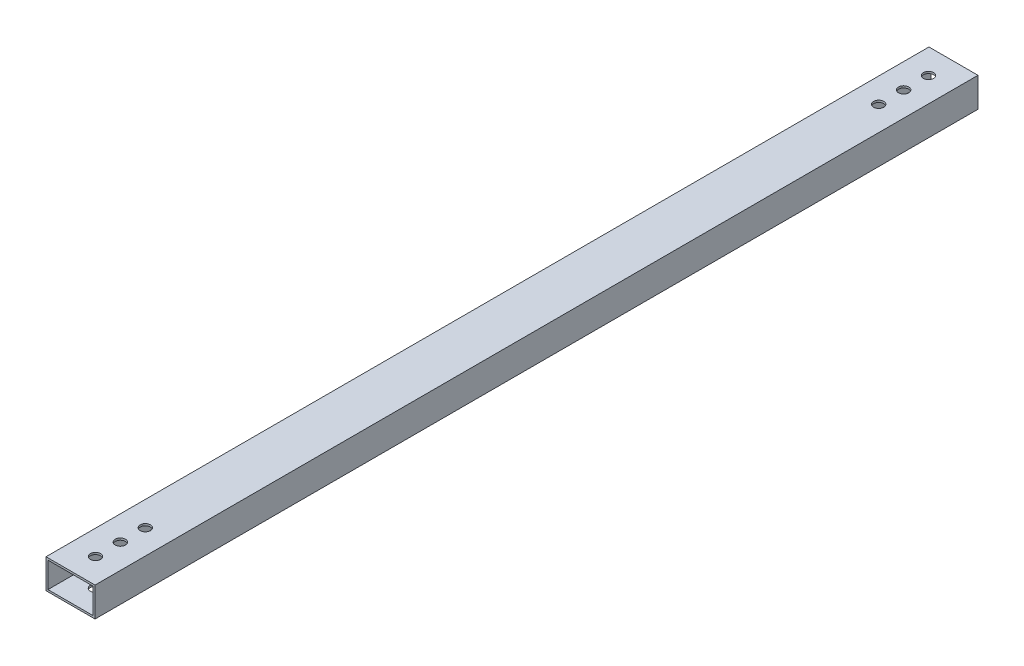
ISO-10303-21;
HEADER;
FILE_DESCRIPTION(('STEP AP214'),'2;1');
FILE_NAME('part.step','',(''),(''),'','','');
FILE_SCHEMA(('AUTOMOTIVE_DESIGN { 1 0 10303 214 1 1 1 1 }'));
ENDSEC;
DATA;
#1=APPLICATION_CONTEXT('core data for automotive mechanical design processes');
#2=APPLICATION_PROTOCOL_DEFINITION('international standard','automotive_design',2000,#1);
#3=PRODUCT_CONTEXT('',#1,'mechanical');
#4=PRODUCT('Part','Part','',(#3));
#5=PRODUCT_RELATED_PRODUCT_CATEGORY('part','',(#4));
#6=PRODUCT_DEFINITION_FORMATION('','',#4);
#7=PRODUCT_DEFINITION_CONTEXT('part definition',#1,'design');
#8=PRODUCT_DEFINITION('design','',#6,#7);
#9=PRODUCT_DEFINITION_SHAPE('','',#8);
#10=(LENGTH_UNIT() NAMED_UNIT(*) SI_UNIT(.MILLI.,.METRE.));
#11=(NAMED_UNIT(*) PLANE_ANGLE_UNIT() SI_UNIT($,.RADIAN.));
#12=(NAMED_UNIT(*) SI_UNIT($,.STERADIAN.) SOLID_ANGLE_UNIT());
#13=UNCERTAINTY_MEASURE_WITH_UNIT(LENGTH_MEASURE(1.E-05),#10,'distance_accuracy_value','');
#14=(GEOMETRIC_REPRESENTATION_CONTEXT(3) GLOBAL_UNCERTAINTY_ASSIGNED_CONTEXT((#13)) GLOBAL_UNIT_ASSIGNED_CONTEXT((#10,
#11,#12)) REPRESENTATION_CONTEXT('',''));
#15=CARTESIAN_POINT('',(0.,0.,0.));
#16=DIRECTION('',(0.,0.,1.));
#17=DIRECTION('',(1.,0.,0.));
#18=AXIS2_PLACEMENT_3D('',#15,#16,#17);
#19=CARTESIAN_POINT('',(0.,0.,450.));
#20=DIRECTION('',(0.,0.,1.));
#21=DIRECTION('',(1.,0.,0.));
#22=AXIS2_PLACEMENT_3D('',#19,#20,#21);
#23=PLANE('',#22);
#24=DIRECTION('',(0.,1.,0.));
#25=VECTOR('',#24,1.);
#26=CARTESIAN_POINT('',(12.5,7.5,450.));
#27=LINE('',#26,#25);
#28=CARTESIAN_POINT('',(12.5,-7.5,450.));
#29=VERTEX_POINT('',#28);
#30=CARTESIAN_POINT('',(12.5,7.5,450.));
#31=VERTEX_POINT('',#30);
#32=EDGE_CURVE('E143',#29,#31,#27,.T.);
#33=ORIENTED_EDGE('',*,*,#32,.T.);
#34=DIRECTION('',(-1.,0.,0.));
#35=VECTOR('',#34,1.);
#36=CARTESIAN_POINT('',(-12.5,7.5,450.));
#37=LINE('',#36,#35);
#38=CARTESIAN_POINT('',(-12.5,7.5,450.));
#39=VERTEX_POINT('',#38);
#40=EDGE_CURVE('E146',#31,#39,#37,.T.);
#41=ORIENTED_EDGE('',*,*,#40,.T.);
#42=DIRECTION('',(0.,-1.,0.));
#43=VECTOR('',#42,1.);
#44=CARTESIAN_POINT('',(-12.5,7.5,450.));
#45=LINE('',#44,#43);
#46=CARTESIAN_POINT('',(-12.5,-7.5,450.));
#47=VERTEX_POINT('',#46);
#48=EDGE_CURVE('E149',#39,#47,#45,.T.);
#49=ORIENTED_EDGE('',*,*,#48,.T.);
#50=DIRECTION('',(1.,0.,0.));
#51=VECTOR('',#50,1.);
#52=CARTESIAN_POINT('',(-12.5,-7.5,450.));
#53=LINE('',#52,#51);
#54=EDGE_CURVE('E151',#47,#29,#53,.T.);
#55=ORIENTED_EDGE('',*,*,#54,.T.);
#56=EDGE_LOOP('',(#33,#41,#49,#55));
#57=FACE_BOUND('',#56,.T.);
#58=DIRECTION('',(0.,-1.,0.));
#59=VECTOR('',#58,1.);
#60=CARTESIAN_POINT('',(-11.5,6.5,450.));
#61=LINE('',#60,#59);
#62=CARTESIAN_POINT('',(-11.5,6.5,450.));
#63=VERTEX_POINT('',#62);
#64=CARTESIAN_POINT('',(-11.5,-6.5,450.));
#65=VERTEX_POINT('',#64);
#66=EDGE_CURVE('E113',#63,#65,#61,.T.);
#67=ORIENTED_EDGE('',*,*,#66,.F.);
#68=DIRECTION('',(-1.,0.,0.));
#69=VECTOR('',#68,1.);
#70=CARTESIAN_POINT('',(-11.5,6.5,450.));
#71=LINE('',#70,#69);
#72=CARTESIAN_POINT('',(11.5,6.5,450.));
#73=VERTEX_POINT('',#72);
#74=EDGE_CURVE('E105',#73,#63,#71,.T.);
#75=ORIENTED_EDGE('',*,*,#74,.F.);
#76=DIRECTION('',(0.,1.,0.));
#77=VECTOR('',#76,1.);
#78=CARTESIAN_POINT('',(11.5,6.5,450.));
#79=LINE('',#78,#77);
#80=CARTESIAN_POINT('',(11.5,-6.5,450.));
#81=VERTEX_POINT('',#80);
#82=EDGE_CURVE('E127',#81,#73,#79,.T.);
#83=ORIENTED_EDGE('',*,*,#82,.F.);
#84=DIRECTION('',(1.,0.,0.));
#85=VECTOR('',#84,1.);
#86=CARTESIAN_POINT('',(-11.5,-6.5,450.));
#87=LINE('',#86,#85);
#88=EDGE_CURVE('E125',#65,#81,#87,.T.);
#89=ORIENTED_EDGE('',*,*,#88,.F.);
#90=EDGE_LOOP('',(#67,#75,#83,#89));
#91=FACE_BOUND('',#90,.T.);
#92=ADVANCED_FACE('F38',(#57,#91),#23,.T.);
#93=CARTESIAN_POINT('',(0.,0.,0.));
#94=DIRECTION('',(0.,0.,1.));
#95=DIRECTION('',(1.,0.,0.));
#96=AXIS2_PLACEMENT_3D('',#93,#94,#95);
#97=PLANE('',#96);
#98=DIRECTION('',(0.,1.,0.));
#99=VECTOR('',#98,1.);
#100=CARTESIAN_POINT('',(12.5,7.5,0.));
#101=LINE('',#100,#99);
#102=CARTESIAN_POINT('',(12.5,-7.5,0.));
#103=VERTEX_POINT('',#102);
#104=CARTESIAN_POINT('',(12.5,7.5,0.));
#105=VERTEX_POINT('',#104);
#106=EDGE_CURVE('E121',#103,#105,#101,.T.);
#107=ORIENTED_EDGE('',*,*,#106,.F.);
#108=DIRECTION('',(1.,0.,0.));
#109=VECTOR('',#108,1.);
#110=CARTESIAN_POINT('',(-12.5,-7.5,0.));
#111=LINE('',#110,#109);
#112=CARTESIAN_POINT('',(-12.5,-7.5,0.));
#113=VERTEX_POINT('',#112);
#114=EDGE_CURVE('E147',#113,#103,#111,.T.);
#115=ORIENTED_EDGE('',*,*,#114,.F.);
#116=DIRECTION('',(0.,-1.,0.));
#117=VECTOR('',#116,1.);
#118=CARTESIAN_POINT('',(-12.5,7.5,0.));
#119=LINE('',#118,#117);
#120=CARTESIAN_POINT('',(-12.5,7.5,0.));
#121=VERTEX_POINT('',#120);
#122=EDGE_CURVE('E158',#121,#113,#119,.T.);
#123=ORIENTED_EDGE('',*,*,#122,.F.);
#124=DIRECTION('',(-1.,0.,0.));
#125=VECTOR('',#124,1.);
#126=CARTESIAN_POINT('',(-12.5,7.5,0.));
#127=LINE('',#126,#125);
#128=EDGE_CURVE('E156',#105,#121,#127,.T.);
#129=ORIENTED_EDGE('',*,*,#128,.F.);
#130=EDGE_LOOP('',(#107,#115,#123,#129));
#131=FACE_BOUND('',#130,.T.);
#132=DIRECTION('',(-1.,0.,0.));
#133=VECTOR('',#132,1.);
#134=CARTESIAN_POINT('',(-11.5,6.5,0.));
#135=LINE('',#134,#133);
#136=CARTESIAN_POINT('',(11.5,6.5,0.));
#137=VERTEX_POINT('',#136);
#138=CARTESIAN_POINT('',(-11.5,6.5,0.));
#139=VERTEX_POINT('',#138);
#140=EDGE_CURVE('E63',#137,#139,#135,.T.);
#141=ORIENTED_EDGE('',*,*,#140,.T.);
#142=DIRECTION('',(0.,-1.,0.));
#143=VECTOR('',#142,1.);
#144=CARTESIAN_POINT('',(-11.5,6.5,0.));
#145=LINE('',#144,#143);
#146=CARTESIAN_POINT('',(-11.5,-6.5,0.));
#147=VERTEX_POINT('',#146);
#148=EDGE_CURVE('E120',#139,#147,#145,.T.);
#149=ORIENTED_EDGE('',*,*,#148,.T.);
#150=DIRECTION('',(1.,0.,0.));
#151=VECTOR('',#150,1.);
#152=CARTESIAN_POINT('',(-11.5,-6.5,0.));
#153=LINE('',#152,#151);
#154=CARTESIAN_POINT('',(11.5,-6.5,0.));
#155=VERTEX_POINT('',#154);
#156=EDGE_CURVE('E135',#147,#155,#153,.T.);
#157=ORIENTED_EDGE('',*,*,#156,.T.);
#158=DIRECTION('',(0.,1.,0.));
#159=VECTOR('',#158,1.);
#160=CARTESIAN_POINT('',(11.5,6.5,0.));
#161=LINE('',#160,#159);
#162=EDGE_CURVE('E114',#155,#137,#161,.T.);
#163=ORIENTED_EDGE('',*,*,#162,.T.);
#164=EDGE_LOOP('',(#141,#149,#157,#163));
#165=FACE_BOUND('',#164,.T.);
#166=ADVANCED_FACE('F260',(#131,#165),#97,.F.);
#167=CARTESIAN_POINT('',(12.5,7.5,450.));
#168=DIRECTION('',(-1.,0.,0.));
#169=DIRECTION('',(0.,-1.,0.));
#170=AXIS2_PLACEMENT_3D('',#167,#168,#169);
#171=PLANE('',#170);
#172=ORIENTED_EDGE('',*,*,#106,.T.);
#173=DIRECTION('',(0.,0.,-1.));
#174=VECTOR('',#173,1.);
#175=CARTESIAN_POINT('',(12.5,7.5,450.));
#176=LINE('',#175,#174);
#177=EDGE_CURVE('E11',#31,#105,#176,.T.);
#178=ORIENTED_EDGE('',*,*,#177,.F.);
#179=ORIENTED_EDGE('',*,*,#32,.F.);
#180=DIRECTION('',(0.,0.,-1.));
#181=VECTOR('',#180,1.);
#182=CARTESIAN_POINT('',(12.5,-7.5,450.));
#183=LINE('',#182,#181);
#184=EDGE_CURVE('E153',#29,#103,#183,.T.);
#185=ORIENTED_EDGE('',*,*,#184,.T.);
#186=EDGE_LOOP('',(#172,#178,#179,#185));
#187=FACE_BOUND('',#186,.T.);
#188=ADVANCED_FACE('F40',(#187),#171,.F.);
#189=CARTESIAN_POINT('',(-12.5,7.5,450.));
#190=DIRECTION('',(0.,-1.,0.));
#191=DIRECTION('',(0.,0.,-1.));
#192=AXIS2_PLACEMENT_3D('',#189,#190,#191);
#193=PLANE('',#192);
#194=CARTESIAN_POINT('',(0.,7.5,437.3));
#195=DIRECTION('',(0.,-1.,0.));
#196=DIRECTION('',(0.,0.,-1.));
#197=AXIS2_PLACEMENT_3D('',#194,#195,#196);
#198=CIRCLE('',#197,2.6);
#199=CARTESIAN_POINT('',(0.,7.5,434.7));
#200=VERTEX_POINT('',#199);
#201=EDGE_CURVE('E500',#200,#200,#198,.T.);
#202=ORIENTED_EDGE('',*,*,#201,.T.);
#203=EDGE_LOOP('',(#202));
#204=FACE_BOUND('',#203,.T.);
#205=CARTESIAN_POINT('',(0.,7.5,424.6));
#206=DIRECTION('',(0.,-1.,0.));
#207=DIRECTION('',(0.,0.,-1.));
#208=AXIS2_PLACEMENT_3D('',#205,#206,#207);
#209=CIRCLE('',#208,2.6);
#210=CARTESIAN_POINT('',(0.,7.5,422.));
#211=VERTEX_POINT('',#210);
#212=EDGE_CURVE('E506',#211,#211,#209,.T.);
#213=ORIENTED_EDGE('',*,*,#212,.T.);
#214=EDGE_LOOP('',(#213));
#215=FACE_BOUND('',#214,.T.);
#216=CARTESIAN_POINT('',(0.,7.5,411.9));
#217=DIRECTION('',(0.,-1.,0.));
#218=DIRECTION('',(0.,0.,-1.));
#219=AXIS2_PLACEMENT_3D('',#216,#217,#218);
#220=CIRCLE('',#219,2.6);
#221=CARTESIAN_POINT('',(0.,7.5,409.3));
#222=VERTEX_POINT('',#221);
#223=EDGE_CURVE('E196',#222,#222,#220,.T.);
#224=ORIENTED_EDGE('',*,*,#223,.T.);
#225=EDGE_LOOP('',(#224));
#226=FACE_BOUND('',#225,.T.);
#227=CARTESIAN_POINT('',(0.,7.5,12.7));
#228=DIRECTION('',(0.,1.,0.));
#229=DIRECTION('',(0.,0.,1.));
#230=AXIS2_PLACEMENT_3D('',#227,#228,#229);
#231=CIRCLE('',#230,2.6);
#232=CARTESIAN_POINT('',(0.,7.5,15.3));
#233=VERTEX_POINT('',#232);
#234=EDGE_CURVE('E205',#233,#233,#231,.T.);
#235=ORIENTED_EDGE('',*,*,#234,.F.);
#236=EDGE_LOOP('',(#235));
#237=FACE_BOUND('',#236,.T.);
#238=CARTESIAN_POINT('',(0.,7.5,25.4));
#239=DIRECTION('',(0.,1.,0.));
#240=DIRECTION('',(0.,0.,1.));
#241=AXIS2_PLACEMENT_3D('',#238,#239,#240);
#242=CIRCLE('',#241,2.6);
#243=CARTESIAN_POINT('',(0.,7.5,28.));
#244=VERTEX_POINT('',#243);
#245=EDGE_CURVE('E208',#244,#244,#242,.T.);
#246=ORIENTED_EDGE('',*,*,#245,.F.);
#247=EDGE_LOOP('',(#246));
#248=FACE_BOUND('',#247,.T.);
#249=CARTESIAN_POINT('',(0.,7.5,38.1));
#250=DIRECTION('',(0.,1.,0.));
#251=DIRECTION('',(0.,0.,1.));
#252=AXIS2_PLACEMENT_3D('',#249,#250,#251);
#253=CIRCLE('',#252,2.6);
#254=CARTESIAN_POINT('',(0.,7.5,40.7));
#255=VERTEX_POINT('',#254);
#256=EDGE_CURVE('E214',#255,#255,#253,.T.);
#257=ORIENTED_EDGE('',*,*,#256,.F.);
#258=EDGE_LOOP('',(#257));
#259=FACE_BOUND('',#258,.T.);
#260=ORIENTED_EDGE('',*,*,#128,.T.);
#261=DIRECTION('',(0.,0.,-1.));
#262=VECTOR('',#261,1.);
#263=CARTESIAN_POINT('',(-12.5,7.5,450.));
#264=LINE('',#263,#262);
#265=EDGE_CURVE('E47',#39,#121,#264,.T.);
#266=ORIENTED_EDGE('',*,*,#265,.F.);
#267=ORIENTED_EDGE('',*,*,#40,.F.);
#268=ORIENTED_EDGE('',*,*,#177,.T.);
#269=EDGE_LOOP('',(#260,#266,#267,#268));
#270=FACE_BOUND('',#269,.T.);
#271=ADVANCED_FACE('F246',(#204,#215,#226,#237,#248,#259,#270),#193,.F.);
#272=CARTESIAN_POINT('',(-12.5,7.5,450.));
#273=DIRECTION('',(1.,0.,0.));
#274=DIRECTION('',(0.,1.,0.));
#275=AXIS2_PLACEMENT_3D('',#272,#273,#274);
#276=PLANE('',#275);
#277=ORIENTED_EDGE('',*,*,#122,.T.);
#278=DIRECTION('',(0.,0.,-1.));
#279=VECTOR('',#278,1.);
#280=CARTESIAN_POINT('',(-12.5,-7.5,450.));
#281=LINE('',#280,#279);
#282=EDGE_CURVE('E163',#47,#113,#281,.T.);
#283=ORIENTED_EDGE('',*,*,#282,.F.);
#284=ORIENTED_EDGE('',*,*,#48,.F.);
#285=ORIENTED_EDGE('',*,*,#265,.T.);
#286=EDGE_LOOP('',(#277,#283,#284,#285));
#287=FACE_BOUND('',#286,.T.);
#288=ADVANCED_FACE('F249',(#287),#276,.F.);
#289=CARTESIAN_POINT('',(-12.5,-7.5,450.));
#290=DIRECTION('',(0.,1.,0.));
#291=DIRECTION('',(0.,0.,1.));
#292=AXIS2_PLACEMENT_3D('',#289,#290,#291);
#293=PLANE('',#292);
#294=CARTESIAN_POINT('',(0.,-7.5,437.3));
#295=DIRECTION('',(0.,-1.,0.));
#296=DIRECTION('',(0.,0.,-1.));
#297=AXIS2_PLACEMENT_3D('',#294,#295,#296);
#298=CIRCLE('',#297,2.6);
#299=CARTESIAN_POINT('',(0.,-7.5,434.7));
#300=VERTEX_POINT('',#299);
#301=EDGE_CURVE('E183',#300,#300,#298,.T.);
#302=ORIENTED_EDGE('',*,*,#301,.F.);
#303=EDGE_LOOP('',(#302));
#304=FACE_BOUND('',#303,.T.);
#305=CARTESIAN_POINT('',(0.,-7.5,424.6));
#306=DIRECTION('',(0.,-1.,0.));
#307=DIRECTION('',(0.,0.,-1.));
#308=AXIS2_PLACEMENT_3D('',#305,#306,#307);
#309=CIRCLE('',#308,2.6);
#310=CARTESIAN_POINT('',(0.,-7.5,422.));
#311=VERTEX_POINT('',#310);
#312=EDGE_CURVE('E501',#311,#311,#309,.T.);
#313=ORIENTED_EDGE('',*,*,#312,.F.);
#314=EDGE_LOOP('',(#313));
#315=FACE_BOUND('',#314,.T.);
#316=CARTESIAN_POINT('',(0.,-7.5,411.9));
#317=DIRECTION('',(0.,-1.,0.));
#318=DIRECTION('',(0.,0.,-1.));
#319=AXIS2_PLACEMENT_3D('',#316,#317,#318);
#320=CIRCLE('',#319,2.6);
#321=CARTESIAN_POINT('',(0.,-7.5,409.3));
#322=VERTEX_POINT('',#321);
#323=EDGE_CURVE('E510',#322,#322,#320,.T.);
#324=ORIENTED_EDGE('',*,*,#323,.F.);
#325=EDGE_LOOP('',(#324));
#326=FACE_BOUND('',#325,.T.);
#327=CARTESIAN_POINT('',(0.,-7.5,12.7));
#328=DIRECTION('',(0.,1.,0.));
#329=DIRECTION('',(0.,0.,1.));
#330=AXIS2_PLACEMENT_3D('',#327,#328,#329);
#331=CIRCLE('',#330,2.6);
#332=CARTESIAN_POINT('',(0.,-7.5,15.3));
#333=VERTEX_POINT('',#332);
#334=EDGE_CURVE('E172',#333,#333,#331,.T.);
#335=ORIENTED_EDGE('',*,*,#334,.T.);
#336=EDGE_LOOP('',(#335));
#337=FACE_BOUND('',#336,.T.);
#338=CARTESIAN_POINT('',(0.,-7.5,25.4));
#339=DIRECTION('',(0.,1.,0.));
#340=DIRECTION('',(0.,0.,1.));
#341=AXIS2_PLACEMENT_3D('',#338,#339,#340);
#342=CIRCLE('',#341,2.6);
#343=CARTESIAN_POINT('',(0.,-7.5,28.));
#344=VERTEX_POINT('',#343);
#345=EDGE_CURVE('E211',#344,#344,#342,.T.);
#346=ORIENTED_EDGE('',*,*,#345,.T.);
#347=EDGE_LOOP('',(#346));
#348=FACE_BOUND('',#347,.T.);
#349=CARTESIAN_POINT('',(0.,-7.5,38.1));
#350=DIRECTION('',(0.,1.,0.));
#351=DIRECTION('',(0.,0.,1.));
#352=AXIS2_PLACEMENT_3D('',#349,#350,#351);
#353=CIRCLE('',#352,2.6);
#354=CARTESIAN_POINT('',(0.,-7.5,40.7));
#355=VERTEX_POINT('',#354);
#356=EDGE_CURVE('E202',#355,#355,#353,.T.);
#357=ORIENTED_EDGE('',*,*,#356,.T.);
#358=EDGE_LOOP('',(#357));
#359=FACE_BOUND('',#358,.T.);
#360=ORIENTED_EDGE('',*,*,#114,.T.);
#361=ORIENTED_EDGE('',*,*,#184,.F.);
#362=ORIENTED_EDGE('',*,*,#54,.F.);
#363=ORIENTED_EDGE('',*,*,#282,.T.);
#364=EDGE_LOOP('',(#360,#361,#362,#363));
#365=FACE_BOUND('',#364,.T.);
#366=ADVANCED_FACE('F230',(#304,#315,#326,#337,#348,#359,#365),#293,.F.);
#367=CARTESIAN_POINT('',(-11.5,6.5,450.));
#368=DIRECTION('',(0.,-1.,0.));
#369=DIRECTION('',(0.,0.,-1.));
#370=AXIS2_PLACEMENT_3D('',#367,#368,#369);
#371=PLANE('',#370);
#372=CARTESIAN_POINT('',(0.,6.5,437.3));
#373=DIRECTION('',(0.,-1.,0.));
#374=DIRECTION('',(0.,0.,-1.));
#375=AXIS2_PLACEMENT_3D('',#372,#373,#374);
#376=CIRCLE('',#375,2.6);
#377=CARTESIAN_POINT('',(0.,6.5,434.7));
#378=VERTEX_POINT('',#377);
#379=EDGE_CURVE('E199',#378,#378,#376,.F.);
#380=ORIENTED_EDGE('',*,*,#379,.T.);
#381=EDGE_LOOP('',(#380));
#382=FACE_BOUND('',#381,.T.);
#383=CARTESIAN_POINT('',(0.,6.5,424.6));
#384=DIRECTION('',(0.,-1.,0.));
#385=DIRECTION('',(0.,0.,-1.));
#386=AXIS2_PLACEMENT_3D('',#383,#384,#385);
#387=CIRCLE('',#386,2.6);
#388=CARTESIAN_POINT('',(0.,6.5,422.));
#389=VERTEX_POINT('',#388);
#390=EDGE_CURVE('E186',#389,#389,#387,.F.);
#391=ORIENTED_EDGE('',*,*,#390,.T.);
#392=EDGE_LOOP('',(#391));
#393=FACE_BOUND('',#392,.T.);
#394=CARTESIAN_POINT('',(0.,6.5,411.9));
#395=DIRECTION('',(0.,-1.,0.));
#396=DIRECTION('',(0.,0.,-1.));
#397=AXIS2_PLACEMENT_3D('',#394,#395,#396);
#398=CIRCLE('',#397,2.6);
#399=CARTESIAN_POINT('',(0.,6.5,409.3));
#400=VERTEX_POINT('',#399);
#401=EDGE_CURVE('E182',#400,#400,#398,.F.);
#402=ORIENTED_EDGE('',*,*,#401,.T.);
#403=EDGE_LOOP('',(#402));
#404=FACE_BOUND('',#403,.T.);
#405=CARTESIAN_POINT('',(0.,6.5,12.7));
#406=DIRECTION('',(0.,-1.,0.));
#407=DIRECTION('',(0.,0.,-1.));
#408=AXIS2_PLACEMENT_3D('',#405,#406,#407);
#409=CIRCLE('',#408,2.6);
#410=CARTESIAN_POINT('',(0.,6.5,10.1));
#411=VERTEX_POINT('',#410);
#412=EDGE_CURVE('E133',#411,#411,#409,.T.);
#413=ORIENTED_EDGE('',*,*,#412,.F.);
#414=EDGE_LOOP('',(#413));
#415=FACE_BOUND('',#414,.T.);
#416=CARTESIAN_POINT('',(0.,6.5,25.4));
#417=DIRECTION('',(0.,-1.,0.));
#418=DIRECTION('',(0.,0.,-1.));
#419=AXIS2_PLACEMENT_3D('',#416,#417,#418);
#420=CIRCLE('',#419,2.6);
#421=CARTESIAN_POINT('',(0.,6.5,22.8));
#422=VERTEX_POINT('',#421);
#423=EDGE_CURVE('E176',#422,#422,#420,.T.);
#424=ORIENTED_EDGE('',*,*,#423,.F.);
#425=EDGE_LOOP('',(#424));
#426=FACE_BOUND('',#425,.T.);
#427=CARTESIAN_POINT('',(0.,6.5,38.1));
#428=DIRECTION('',(0.,-1.,0.));
#429=DIRECTION('',(0.,0.,-1.));
#430=AXIS2_PLACEMENT_3D('',#427,#428,#429);
#431=CIRCLE('',#430,2.6);
#432=CARTESIAN_POINT('',(0.,6.5,35.5));
#433=VERTEX_POINT('',#432);
#434=EDGE_CURVE('E171',#433,#433,#431,.T.);
#435=ORIENTED_EDGE('',*,*,#434,.F.);
#436=EDGE_LOOP('',(#435));
#437=FACE_BOUND('',#436,.T.);
#438=ORIENTED_EDGE('',*,*,#140,.F.);
#439=DIRECTION('',(0.,0.,-1.));
#440=VECTOR('',#439,1.);
#441=CARTESIAN_POINT('',(11.5,6.5,450.));
#442=LINE('',#441,#440);
#443=EDGE_CURVE('E109',#73,#137,#442,.T.);
#444=ORIENTED_EDGE('',*,*,#443,.F.);
#445=ORIENTED_EDGE('',*,*,#74,.T.);
#446=DIRECTION('',(0.,0.,-1.));
#447=VECTOR('',#446,1.);
#448=CARTESIAN_POINT('',(-11.5,6.5,450.));
#449=LINE('',#448,#447);
#450=EDGE_CURVE('E108',#63,#139,#449,.T.);
#451=ORIENTED_EDGE('',*,*,#450,.T.);
#452=EDGE_LOOP('',(#438,#444,#445,#451));
#453=FACE_BOUND('',#452,.T.);
#454=ADVANCED_FACE('F107',(#382,#393,#404,#415,#426,#437,#453),#371,.T.);
#455=CARTESIAN_POINT('',(-11.5,6.5,450.));
#456=DIRECTION('',(1.,0.,0.));
#457=DIRECTION('',(0.,1.,0.));
#458=AXIS2_PLACEMENT_3D('',#455,#456,#457);
#459=PLANE('',#458);
#460=ORIENTED_EDGE('',*,*,#148,.F.);
#461=ORIENTED_EDGE('',*,*,#450,.F.);
#462=ORIENTED_EDGE('',*,*,#66,.T.);
#463=DIRECTION('',(0.,0.,-1.));
#464=VECTOR('',#463,1.);
#465=CARTESIAN_POINT('',(-11.5,-6.5,450.));
#466=LINE('',#465,#464);
#467=EDGE_CURVE('E122',#65,#147,#466,.T.);
#468=ORIENTED_EDGE('',*,*,#467,.T.);
#469=EDGE_LOOP('',(#460,#461,#462,#468));
#470=FACE_BOUND('',#469,.T.);
#471=ADVANCED_FACE('F117',(#470),#459,.T.);
#472=CARTESIAN_POINT('',(-11.5,-6.5,450.));
#473=DIRECTION('',(0.,1.,0.));
#474=DIRECTION('',(0.,0.,1.));
#475=AXIS2_PLACEMENT_3D('',#472,#473,#474);
#476=PLANE('',#475);
#477=CARTESIAN_POINT('',(0.,-6.5,437.3));
#478=DIRECTION('',(0.,1.,0.));
#479=DIRECTION('',(0.,0.,1.));
#480=AXIS2_PLACEMENT_3D('',#477,#478,#479);
#481=CIRCLE('',#480,2.6);
#482=CARTESIAN_POINT('',(0.,-6.5,439.9));
#483=VERTEX_POINT('',#482);
#484=EDGE_CURVE('E42',#483,#483,#481,.F.);
#485=ORIENTED_EDGE('',*,*,#484,.T.);
#486=EDGE_LOOP('',(#485));
#487=FACE_BOUND('',#486,.T.);
#488=CARTESIAN_POINT('',(0.,-6.5,424.6));
#489=DIRECTION('',(0.,1.,0.));
#490=DIRECTION('',(0.,0.,1.));
#491=AXIS2_PLACEMENT_3D('',#488,#489,#490);
#492=CIRCLE('',#491,2.6);
#493=CARTESIAN_POINT('',(0.,-6.5,427.2));
#494=VERTEX_POINT('',#493);
#495=EDGE_CURVE('E184',#494,#494,#492,.F.);
#496=ORIENTED_EDGE('',*,*,#495,.T.);
#497=EDGE_LOOP('',(#496));
#498=FACE_BOUND('',#497,.T.);
#499=CARTESIAN_POINT('',(0.,-6.5,411.9));
#500=DIRECTION('',(0.,1.,0.));
#501=DIRECTION('',(0.,0.,1.));
#502=AXIS2_PLACEMENT_3D('',#499,#500,#501);
#503=CIRCLE('',#502,2.6);
#504=CARTESIAN_POINT('',(0.,-6.5,414.5));
#505=VERTEX_POINT('',#504);
#506=EDGE_CURVE('E180',#505,#505,#503,.F.);
#507=ORIENTED_EDGE('',*,*,#506,.T.);
#508=EDGE_LOOP('',(#507));
#509=FACE_BOUND('',#508,.T.);
#510=CARTESIAN_POINT('',(0.,-6.5,12.7));
#511=DIRECTION('',(0.,1.,0.));
#512=DIRECTION('',(0.,0.,1.));
#513=AXIS2_PLACEMENT_3D('',#510,#511,#512);
#514=CIRCLE('',#513,2.6);
#515=CARTESIAN_POINT('',(0.,-6.5,15.3));
#516=VERTEX_POINT('',#515);
#517=EDGE_CURVE('E177',#516,#516,#514,.T.);
#518=ORIENTED_EDGE('',*,*,#517,.F.);
#519=EDGE_LOOP('',(#518));
#520=FACE_BOUND('',#519,.T.);
#521=CARTESIAN_POINT('',(0.,-6.5,25.4));
#522=DIRECTION('',(0.,1.,0.));
#523=DIRECTION('',(0.,0.,1.));
#524=AXIS2_PLACEMENT_3D('',#521,#522,#523);
#525=CIRCLE('',#524,2.6);
#526=CARTESIAN_POINT('',(0.,-6.5,28.));
#527=VERTEX_POINT('',#526);
#528=EDGE_CURVE('E173',#527,#527,#525,.T.);
#529=ORIENTED_EDGE('',*,*,#528,.F.);
#530=EDGE_LOOP('',(#529));
#531=FACE_BOUND('',#530,.T.);
#532=CARTESIAN_POINT('',(0.,-6.5,38.1));
#533=DIRECTION('',(0.,1.,0.));
#534=DIRECTION('',(0.,0.,1.));
#535=AXIS2_PLACEMENT_3D('',#532,#533,#534);
#536=CIRCLE('',#535,2.6);
#537=CARTESIAN_POINT('',(0.,-6.5,40.7));
#538=VERTEX_POINT('',#537);
#539=EDGE_CURVE('E168',#538,#538,#536,.T.);
#540=ORIENTED_EDGE('',*,*,#539,.F.);
#541=EDGE_LOOP('',(#540));
#542=FACE_BOUND('',#541,.T.);
#543=ORIENTED_EDGE('',*,*,#156,.F.);
#544=ORIENTED_EDGE('',*,*,#467,.F.);
#545=ORIENTED_EDGE('',*,*,#88,.T.);
#546=DIRECTION('',(0.,0.,-1.));
#547=VECTOR('',#546,1.);
#548=CARTESIAN_POINT('',(11.5,-6.5,450.));
#549=LINE('',#548,#547);
#550=EDGE_CURVE('E55',#81,#155,#549,.T.);
#551=ORIENTED_EDGE('',*,*,#550,.T.);
#552=EDGE_LOOP('',(#543,#544,#545,#551));
#553=FACE_BOUND('',#552,.T.);
#554=ADVANCED_FACE('F301',(#487,#498,#509,#520,#531,#542,#553),#476,.T.);
#555=CARTESIAN_POINT('',(11.5,6.5,450.));
#556=DIRECTION('',(-1.,0.,0.));
#557=DIRECTION('',(0.,-1.,0.));
#558=AXIS2_PLACEMENT_3D('',#555,#556,#557);
#559=PLANE('',#558);
#560=ORIENTED_EDGE('',*,*,#162,.F.);
#561=ORIENTED_EDGE('',*,*,#550,.F.);
#562=ORIENTED_EDGE('',*,*,#82,.T.);
#563=ORIENTED_EDGE('',*,*,#443,.T.);
#564=EDGE_LOOP('',(#560,#561,#562,#563));
#565=FACE_BOUND('',#564,.T.);
#566=ADVANCED_FACE('F307',(#565),#559,.T.);
#567=CARTESIAN_POINT('',(0.,-7.5,38.1));
#568=DIRECTION('',(0.,1.,0.));
#569=DIRECTION('',(0.,0.,1.));
#570=AXIS2_PLACEMENT_3D('',#567,#568,#569);
#571=CYLINDRICAL_SURFACE('',#570,2.6);
#572=ORIENTED_EDGE('',*,*,#539,.T.);
#573=EDGE_LOOP('',(#572));
#574=FACE_BOUND('',#573,.T.);
#575=ORIENTED_EDGE('',*,*,#356,.F.);
#576=EDGE_LOOP('',(#575));
#577=FACE_BOUND('',#576,.T.);
#578=ADVANCED_FACE('F243',(#574,#577),#571,.F.);
#579=CARTESIAN_POINT('',(0.,-7.5,25.4));
#580=DIRECTION('',(0.,1.,0.));
#581=DIRECTION('',(0.,0.,1.));
#582=AXIS2_PLACEMENT_3D('',#579,#580,#581);
#583=CYLINDRICAL_SURFACE('',#582,2.6);
#584=ORIENTED_EDGE('',*,*,#528,.T.);
#585=EDGE_LOOP('',(#584));
#586=FACE_BOUND('',#585,.T.);
#587=ORIENTED_EDGE('',*,*,#345,.F.);
#588=EDGE_LOOP('',(#587));
#589=FACE_BOUND('',#588,.T.);
#590=ADVANCED_FACE('F321',(#586,#589),#583,.F.);
#591=CARTESIAN_POINT('',(0.,-7.5,12.7));
#592=DIRECTION('',(0.,1.,0.));
#593=DIRECTION('',(0.,0.,1.));
#594=AXIS2_PLACEMENT_3D('',#591,#592,#593);
#595=CYLINDRICAL_SURFACE('',#594,2.6);
#596=ORIENTED_EDGE('',*,*,#517,.T.);
#597=EDGE_LOOP('',(#596));
#598=FACE_BOUND('',#597,.T.);
#599=ORIENTED_EDGE('',*,*,#334,.F.);
#600=EDGE_LOOP('',(#599));
#601=FACE_BOUND('',#600,.T.);
#602=ADVANCED_FACE('F241',(#598,#601),#595,.F.);
#603=ORIENTED_EDGE('',*,*,#434,.T.);
#604=EDGE_LOOP('',(#603));
#605=FACE_BOUND('',#604,.T.);
#606=ORIENTED_EDGE('',*,*,#256,.T.);
#607=EDGE_LOOP('',(#606));
#608=FACE_BOUND('',#607,.T.);
#609=ADVANCED_FACE('F237',(#605,#608),#571,.F.);
#610=ORIENTED_EDGE('',*,*,#423,.T.);
#611=EDGE_LOOP('',(#610));
#612=FACE_BOUND('',#611,.T.);
#613=ORIENTED_EDGE('',*,*,#245,.T.);
#614=EDGE_LOOP('',(#613));
#615=FACE_BOUND('',#614,.T.);
#616=ADVANCED_FACE('F240',(#612,#615),#583,.F.);
#617=ORIENTED_EDGE('',*,*,#412,.T.);
#618=EDGE_LOOP('',(#617));
#619=FACE_BOUND('',#618,.T.);
#620=ORIENTED_EDGE('',*,*,#234,.T.);
#621=EDGE_LOOP('',(#620));
#622=FACE_BOUND('',#621,.T.);
#623=ADVANCED_FACE('F225',(#619,#622),#595,.F.);
#624=CARTESIAN_POINT('',(0.,-7.5,411.9));
#625=DIRECTION('',(0.,1.,0.));
#626=DIRECTION('',(0.,0.,1.));
#627=AXIS2_PLACEMENT_3D('',#624,#625,#626);
#628=CYLINDRICAL_SURFACE('',#627,2.6);
#629=ORIENTED_EDGE('',*,*,#506,.F.);
#630=EDGE_LOOP('',(#629));
#631=FACE_BOUND('',#630,.T.);
#632=ORIENTED_EDGE('',*,*,#323,.T.);
#633=EDGE_LOOP('',(#632));
#634=FACE_BOUND('',#633,.T.);
#635=ADVANCED_FACE('F352',(#631,#634),#628,.F.);
#636=CARTESIAN_POINT('',(0.,-7.5,424.6));
#637=DIRECTION('',(0.,1.,0.));
#638=DIRECTION('',(0.,0.,1.));
#639=AXIS2_PLACEMENT_3D('',#636,#637,#638);
#640=CYLINDRICAL_SURFACE('',#639,2.6);
#641=ORIENTED_EDGE('',*,*,#495,.F.);
#642=EDGE_LOOP('',(#641));
#643=FACE_BOUND('',#642,.T.);
#644=ORIENTED_EDGE('',*,*,#312,.T.);
#645=EDGE_LOOP('',(#644));
#646=FACE_BOUND('',#645,.T.);
#647=ADVANCED_FACE('F357',(#643,#646),#640,.F.);
#648=CARTESIAN_POINT('',(0.,-7.5,437.3));
#649=DIRECTION('',(0.,1.,0.));
#650=DIRECTION('',(0.,0.,1.));
#651=AXIS2_PLACEMENT_3D('',#648,#649,#650);
#652=CYLINDRICAL_SURFACE('',#651,2.6);
#653=ORIENTED_EDGE('',*,*,#484,.F.);
#654=EDGE_LOOP('',(#653));
#655=FACE_BOUND('',#654,.T.);
#656=ORIENTED_EDGE('',*,*,#301,.T.);
#657=EDGE_LOOP('',(#656));
#658=FACE_BOUND('',#657,.T.);
#659=ADVANCED_FACE('F366',(#655,#658),#652,.F.);
#660=ORIENTED_EDGE('',*,*,#401,.F.);
#661=EDGE_LOOP('',(#660));
#662=FACE_BOUND('',#661,.T.);
#663=ORIENTED_EDGE('',*,*,#223,.F.);
#664=EDGE_LOOP('',(#663));
#665=FACE_BOUND('',#664,.T.);
#666=ADVANCED_FACE('F360',(#662,#665),#628,.F.);
#667=ORIENTED_EDGE('',*,*,#390,.F.);
#668=EDGE_LOOP('',(#667));
#669=FACE_BOUND('',#668,.T.);
#670=ORIENTED_EDGE('',*,*,#212,.F.);
#671=EDGE_LOOP('',(#670));
#672=FACE_BOUND('',#671,.T.);
#673=ADVANCED_FACE('F369',(#669,#672),#640,.F.);
#674=ORIENTED_EDGE('',*,*,#379,.F.);
#675=EDGE_LOOP('',(#674));
#676=FACE_BOUND('',#675,.T.);
#677=ORIENTED_EDGE('',*,*,#201,.F.);
#678=EDGE_LOOP('',(#677));
#679=FACE_BOUND('',#678,.T.);
#680=ADVANCED_FACE('F377',(#676,#679),#652,.F.);
#681=CLOSED_SHELL('',(#92,#166,#188,#271,#288,#366,#454,#471,#554,#566,#578,#590,#602,#609,#616,
#623,#635,#647,#659,#666,#673,#680));
#682=MANIFOLD_SOLID_BREP('B2',#681);
#683=ADVANCED_BREP_SHAPE_REPRESENTATION('',(#18,#682),#14);
#684=SHAPE_DEFINITION_REPRESENTATION(#9,#683);
ENDSEC;
END-ISO-10303-21;
